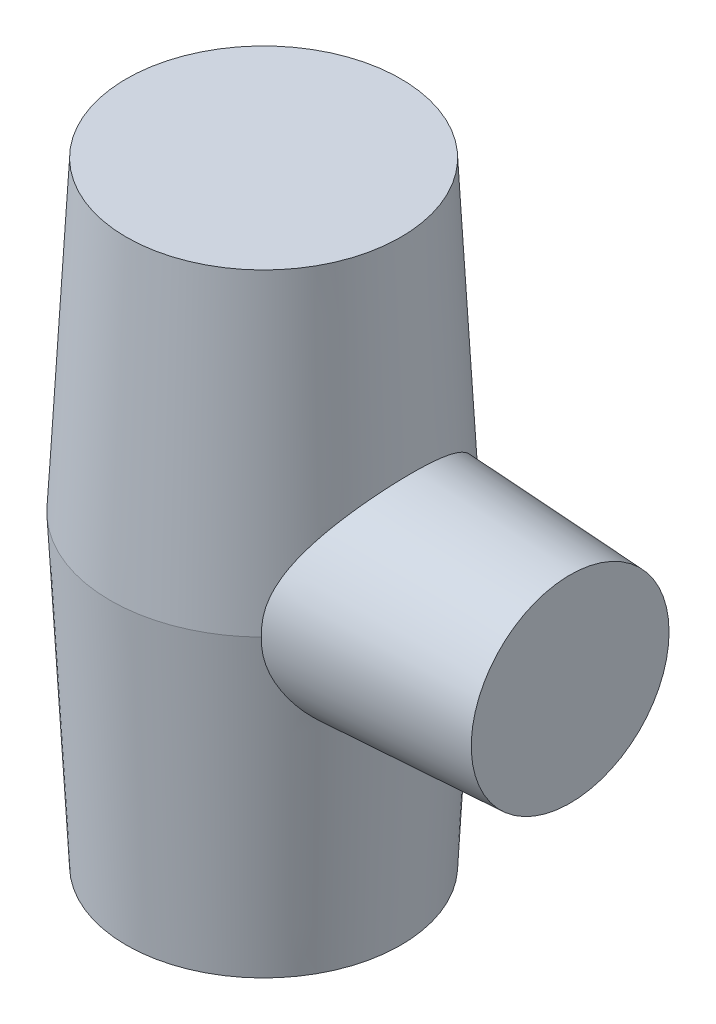
ISO-10303-21;
HEADER;
FILE_DESCRIPTION(('STEP AP214'),'2;1');
FILE_NAME('part.step','',(''),(''),'','','');
FILE_SCHEMA(('AUTOMOTIVE_DESIGN { 1 0 10303 214 1 1 1 1 }'));
ENDSEC;
DATA;
#1=APPLICATION_CONTEXT('core data for automotive mechanical design processes');
#2=APPLICATION_PROTOCOL_DEFINITION('international standard','automotive_design',2000,#1);
#3=PRODUCT_CONTEXT('',#1,'mechanical');
#4=PRODUCT('Part','Part','',(#3));
#5=PRODUCT_RELATED_PRODUCT_CATEGORY('part','',(#4));
#6=PRODUCT_DEFINITION_FORMATION('','',#4);
#7=PRODUCT_DEFINITION_CONTEXT('part definition',#1,'design');
#8=PRODUCT_DEFINITION('design','',#6,#7);
#9=PRODUCT_DEFINITION_SHAPE('','',#8);
#10=(LENGTH_UNIT() NAMED_UNIT(*) SI_UNIT(.MILLI.,.METRE.));
#11=(NAMED_UNIT(*) PLANE_ANGLE_UNIT() SI_UNIT($,.RADIAN.));
#12=(NAMED_UNIT(*) SI_UNIT($,.STERADIAN.) SOLID_ANGLE_UNIT());
#13=UNCERTAINTY_MEASURE_WITH_UNIT(LENGTH_MEASURE(1.E-05),#10,'distance_accuracy_value','');
#14=(GEOMETRIC_REPRESENTATION_CONTEXT(3) GLOBAL_UNCERTAINTY_ASSIGNED_CONTEXT((#13)) GLOBAL_UNIT_ASSIGNED_CONTEXT((#10,
#11,#12)) REPRESENTATION_CONTEXT('',''));
#15=CARTESIAN_POINT('',(0.,0.,0.));
#16=DIRECTION('',(0.,0.,1.));
#17=DIRECTION('',(1.,0.,0.));
#18=AXIS2_PLACEMENT_3D('',#15,#16,#17);
#19=CARTESIAN_POINT('',(0.,0.,0.));
#20=DIRECTION('',(0.,1.,0.));
#21=DIRECTION('',(0.,0.,1.));
#22=AXIS2_PLACEMENT_3D('',#19,#20,#21);
#23=CONICAL_SURFACE('',#22,1.27,0.0523598775598299);
#24=CARTESIAN_POINT('',(0.,-2.54,0.));
#25=DIRECTION('',(0.,1.,0.));
#26=DIRECTION('',(0.,0.,1.));
#27=AXIS2_PLACEMENT_3D('',#24,#25,#26);
#28=CIRCLE('',#27,1.13688424062108);
#29=CARTESIAN_POINT('',(0.,-2.54,1.13688424062108));
#30=VERTEX_POINT('',#29);
#31=EDGE_CURVE('E50',#30,#30,#28,.T.);
#32=ORIENTED_EDGE('',*,*,#31,.T.);
#33=EDGE_LOOP('',(#32));
#34=FACE_BOUND('',#33,.T.);
#35=CARTESIAN_POINT('',(0.,0.,0.));
#36=DIRECTION('',(0.,1.,0.));
#37=DIRECTION('',(0.,0.,1.));
#38=AXIS2_PLACEMENT_3D('',#35,#36,#37);
#39=CIRCLE('',#38,1.27);
#40=CARTESIAN_POINT('',(0.89013230422762,0.,-0.905850142667334));
#41=VERTEX_POINT('',#40);
#42=CARTESIAN_POINT('',(0.89013230422762,0.,0.905850142667334));
#43=VERTEX_POINT('',#42);
#44=EDGE_CURVE('E56',#41,#43,#39,.T.);
#45=ORIENTED_EDGE('',*,*,#44,.F.);
#46=CARTESIAN_POINT('',(0.902993829037968,0.09545,-0.900129472455373));
#47=CARTESIAN_POINT('',(0.899563521077237,0.0773853398247002,-0.902226936848446));
#48=CARTESIAN_POINT('',(0.896664747925735,0.0591576279351425,-0.903759584390583));
#49=CARTESIAN_POINT('',(0.892011780989021,0.0224961633339946,-0.905658388394876));
#50=CARTESIAN_POINT('',(0.890257671408119,0.00406239556585123,-0.906024459048413));
#51=CARTESIAN_POINT('',(0.886860011535402,-0.0509631322679103,-0.905322282522964));
#52=CARTESIAN_POINT('',(0.887003469530997,-0.0876762268203756,-0.902500461803508));
#53=CARTESIAN_POINT('',(0.891955287818575,-0.160118814379447,-0.892242842783682));
#54=CARTESIAN_POINT('',(0.896768043778309,-0.195847347926662,-0.884802699180811));
#55=CARTESIAN_POINT('',(0.910160266259075,-0.265478418949812,-0.865732974699965));
#56=CARTESIAN_POINT('',(0.918749072768013,-0.299376193144448,-0.85409301855054));
#57=CARTESIAN_POINT('',(0.942414725395455,-0.377668811539888,-0.821829855095488));
#58=CARTESIAN_POINT('',(0.958715129242293,-0.420972045395443,-0.799473834494679));
#59=CARTESIAN_POINT('',(0.993621907952189,-0.502750970367946,-0.748557004267139));
#60=CARTESIAN_POINT('',(1.01223295837934,-0.54121654542534,-0.719983522835871));
#61=CARTESIAN_POINT('',(1.0501692397141,-0.614081915694392,-0.656311237232074));
#62=CARTESIAN_POINT('',(1.0695000636707,-0.648341368280668,-0.621055041369575));
#63=CARTESIAN_POINT('',(1.10653005936935,-0.711023167960193,-0.544990645324445));
#64=CARTESIAN_POINT('',(1.12423131018231,-0.73945301119773,-0.504189688759287));
#65=CARTESIAN_POINT('',(1.15479707987866,-0.787191304702011,-0.421883488367413));
#66=CARTESIAN_POINT('',(1.16796873201699,-0.807128850531637,-0.380859935669848));
#67=CARTESIAN_POINT('',(1.19062589201974,-0.840907231765079,-0.295403338089634));
#68=CARTESIAN_POINT('',(1.20011310177312,-0.854750882408927,-0.250971878745396));
#69=CARTESIAN_POINT('',(1.21455332688064,-0.875676204002808,-0.159535283860463));
#70=CARTESIAN_POINT('',(1.21948049556855,-0.882719338724911,-0.112517058626506));
#71=CARTESIAN_POINT('',(1.2241774710219,-0.889435879175606,-0.0177053806453295));
#72=CARTESIAN_POINT('',(1.22394946098893,-0.889112404639077,0.0300877353693051));
#73=CARTESIAN_POINT('',(1.21864672221714,-0.881524364695857,0.120098472806691));
#74=CARTESIAN_POINT('',(1.21404739141158,-0.874940597763992,0.162404853768124));
#75=CARTESIAN_POINT('',(1.20108465235309,-0.856161109266416,0.245141552434992));
#76=CARTESIAN_POINT('',(1.19272069862073,-0.843964574426408,0.28557159732971));
#77=CARTESIAN_POINT('',(1.17252931717718,-0.813975861100101,0.365080522469261));
#78=CARTESIAN_POINT('',(1.16059009868997,-0.796001432842797,0.404061396814618));
#79=CARTESIAN_POINT('',(1.13425134794747,-0.755239072929599,0.478504654435579));
#80=CARTESIAN_POINT('',(1.11985065010083,-0.732448859627796,0.513965358161199));
#81=CARTESIAN_POINT('',(1.08719463381925,-0.678721788909307,0.586195786762102));
#82=CARTESIAN_POINT('',(1.06868765418509,-0.647070045218502,0.622319210795699));
#83=CARTESIAN_POINT('',(1.03124993436713,-0.578550370350181,0.689049959263568));
#84=CARTESIAN_POINT('',(1.01231876497211,-0.541676934603355,0.71965138412374));
#85=CARTESIAN_POINT('',(0.977845227808935,-0.467001968118888,0.772029192668481));
#86=CARTESIAN_POINT('',(0.962154154497761,-0.429678597352142,0.794387311468604));
#87=CARTESIAN_POINT('',(0.933857756057502,-0.351218844644737,0.833652671145697));
#88=CARTESIAN_POINT('',(0.921244808257789,-0.310092236974465,0.850573410787328));
#89=CARTESIAN_POINT('',(0.903565917458215,-0.234284730448333,0.874988175626711));
#90=CARTESIAN_POINT('',(0.897435677682342,-0.200267024377208,0.883751169602216));
#91=CARTESIAN_POINT('',(0.889290183961166,-0.130936906981449,0.897073092401517));
#92=CARTESIAN_POINT('',(0.887269421193179,-0.095626293588111,0.901637644801965));
#93=CARTESIAN_POINT('',(0.88772101446878,-0.0341388391533053,0.905710569463788));
#94=CARTESIAN_POINT('',(0.889147796742904,-0.00801232790410929,0.906235819460731));
#95=CARTESIAN_POINT('',(0.894342522084486,0.0440102565928487,0.904937719289486));
#96=CARTESIAN_POINT('',(0.898115785346357,0.069905670157954,0.903109021889273));
#97=CARTESIAN_POINT('',(0.902993829037968,0.09545,0.900129472455373));
#98=B_SPLINE_CURVE_WITH_KNOTS('',3,(#46,#47,#48,#49,#50,#51,#52,#53,#54,#55,#56,#57,#58,#59,#60,
#61,#62,#63,#64,#65,#66,#67,#68,#69,#70,#71,#72,#73,#74,#75,#76,#77,#78,#79,#80,#81,#82,#83,#84,
#85,#86,#87,#88,#89,#90,#91,#92,#93,#94,#95,#96,#97),.UNSPECIFIED.,.F.,.F.,(4,2,2,2,2,2,2,2,2,2,
2,2,2,2,2,2,2,2,2,2,2,2,2,2,2,4),(0.,0.0554932322940132,0.110990546348686,0.220781523726096,
0.330675958499507,0.440843757883449,0.59418084557976,0.747833426616677,0.905697627430591,
1.06335754386625,1.20519371243617,1.34696428699992,1.48953359308265,1.63204252265469,
1.7606371551114,1.88925042643865,2.02240161472891,2.15561603004799,2.30944088890734,
2.46342912997503,2.60171306613654,2.73965099957207,2.84619644566142,2.9525989713992,
3.03090410318366,3.10938742737697),.UNSPECIFIED.);
#99=EDGE_CURVE('E63',#41,#43,#98,.T.);
#100=ORIENTED_EDGE('',*,*,#99,.T.);
#101=EDGE_LOOP('',(#45,#100));
#102=FACE_BOUND('',#101,.T.);
#103=ADVANCED_FACE('F37',(#34,#102),#23,.T.);
#104=CARTESIAN_POINT('',(0.,0.,0.));
#105=DIRECTION('',(0.,-1.,0.));
#106=DIRECTION('',(0.,0.,1.));
#107=AXIS2_PLACEMENT_3D('',#104,#105,#106);
#108=CONICAL_SURFACE('',#107,1.27,0.0523598775598299);
#109=CARTESIAN_POINT('',(0.,2.54,0.));
#110=DIRECTION('',(0.,1.,0.));
#111=DIRECTION('',(0.,0.,1.));
#112=AXIS2_PLACEMENT_3D('',#109,#110,#111);
#113=CIRCLE('',#112,1.13688424062108);
#114=CARTESIAN_POINT('',(0.,2.54,1.13688424062108));
#115=VERTEX_POINT('',#114);
#116=EDGE_CURVE('E61',#115,#115,#113,.T.);
#117=ORIENTED_EDGE('',*,*,#116,.F.);
#118=EDGE_LOOP('',(#117));
#119=FACE_BOUND('',#118,.T.);
#120=CARTESIAN_POINT('',(0.902993829037968,-0.09545,-0.900129472455373));
#121=CARTESIAN_POINT('',(0.899563521077237,-0.0773853398247002,-0.902226936848446));
#122=CARTESIAN_POINT('',(0.896664747925735,-0.0591576279351425,-0.903759584390583));
#123=CARTESIAN_POINT('',(0.892011780989021,-0.0224961633339946,-0.905658388394876));
#124=CARTESIAN_POINT('',(0.890257671408119,-0.00406239556585123,-0.906024459048413));
#125=CARTESIAN_POINT('',(0.886860011535402,0.0509631322679103,-0.905322282522964));
#126=CARTESIAN_POINT('',(0.887003469530997,0.0876762268203756,-0.902500461803508));
#127=CARTESIAN_POINT('',(0.891955287818575,0.160118814379447,-0.892242842783682));
#128=CARTESIAN_POINT('',(0.896768043778309,0.195847347926662,-0.884802699180811));
#129=CARTESIAN_POINT('',(0.910160266259075,0.265478418949812,-0.865732974699965));
#130=CARTESIAN_POINT('',(0.918749072768013,0.299376193144448,-0.85409301855054));
#131=CARTESIAN_POINT('',(0.942414725395455,0.377668811539888,-0.821829855095488));
#132=CARTESIAN_POINT('',(0.958715129242293,0.420972045395443,-0.799473834494679));
#133=CARTESIAN_POINT('',(0.993621907952189,0.502750970367946,-0.748557004267139));
#134=CARTESIAN_POINT('',(1.01223295837934,0.54121654542534,-0.719983522835871));
#135=CARTESIAN_POINT('',(1.0501692397141,0.614081915694392,-0.656311237232074));
#136=CARTESIAN_POINT('',(1.0695000636707,0.648341368280668,-0.621055041369575));
#137=CARTESIAN_POINT('',(1.10653005936935,0.711023167960193,-0.544990645324445));
#138=CARTESIAN_POINT('',(1.12423131018231,0.73945301119773,-0.504189688759287));
#139=CARTESIAN_POINT('',(1.15479707987866,0.787191304702011,-0.421883488367413));
#140=CARTESIAN_POINT('',(1.16796873201699,0.807128850531637,-0.380859935669848));
#141=CARTESIAN_POINT('',(1.19062589201974,0.840907231765079,-0.295403338089634));
#142=CARTESIAN_POINT('',(1.20011310177312,0.854750882408927,-0.250971878745396));
#143=CARTESIAN_POINT('',(1.21455332688064,0.875676204002808,-0.159535283860463));
#144=CARTESIAN_POINT('',(1.21948049556855,0.882719338724911,-0.112517058626506));
#145=CARTESIAN_POINT('',(1.2241774710219,0.889435879175606,-0.0177053806453295));
#146=CARTESIAN_POINT('',(1.22394946098893,0.889112404639077,0.0300877353693051));
#147=CARTESIAN_POINT('',(1.21864672221714,0.881524364695857,0.120098472806691));
#148=CARTESIAN_POINT('',(1.21404739141158,0.874940597763992,0.162404853768124));
#149=CARTESIAN_POINT('',(1.20108465235309,0.856161109266416,0.245141552434992));
#150=CARTESIAN_POINT('',(1.19272069862073,0.843964574426408,0.28557159732971));
#151=CARTESIAN_POINT('',(1.17252931717718,0.813975861100101,0.365080522469261));
#152=CARTESIAN_POINT('',(1.16059009868997,0.796001432842797,0.404061396814618));
#153=CARTESIAN_POINT('',(1.13425134794747,0.755239072929599,0.478504654435579));
#154=CARTESIAN_POINT('',(1.11985065010083,0.732448859627796,0.513965358161199));
#155=CARTESIAN_POINT('',(1.08719463381925,0.678721788909307,0.586195786762102));
#156=CARTESIAN_POINT('',(1.06868765418509,0.647070045218502,0.622319210795699));
#157=CARTESIAN_POINT('',(1.03124993436713,0.578550370350181,0.689049959263568));
#158=CARTESIAN_POINT('',(1.01231876497211,0.541676934603355,0.71965138412374));
#159=CARTESIAN_POINT('',(0.977845227808935,0.467001968118888,0.772029192668481));
#160=CARTESIAN_POINT('',(0.962154154497761,0.429678597352142,0.794387311468604));
#161=CARTESIAN_POINT('',(0.933857756057502,0.351218844644737,0.833652671145697));
#162=CARTESIAN_POINT('',(0.921244808257789,0.310092236974465,0.850573410787328));
#163=CARTESIAN_POINT('',(0.903565917458215,0.234284730448333,0.874988175626711));
#164=CARTESIAN_POINT('',(0.897435677682342,0.200267024377208,0.883751169602216));
#165=CARTESIAN_POINT('',(0.889290183961166,0.130936906981449,0.897073092401517));
#166=CARTESIAN_POINT('',(0.887269421193179,0.095626293588111,0.901637644801965));
#167=CARTESIAN_POINT('',(0.88772101446878,0.0341388391533053,0.905710569463788));
#168=CARTESIAN_POINT('',(0.889147796742904,0.00801232790410929,0.906235819460731));
#169=CARTESIAN_POINT('',(0.894342522084486,-0.0440102565928487,0.904937719289486));
#170=CARTESIAN_POINT('',(0.898115785346357,-0.069905670157954,0.903109021889273));
#171=CARTESIAN_POINT('',(0.902993829037968,-0.09545,0.900129472455373));
#172=B_SPLINE_CURVE_WITH_KNOTS('',3,(#120,#121,#122,#123,#124,#125,#126,#127,#128,#129,#130,
#131,#132,#133,#134,#135,#136,#137,#138,#139,#140,#141,#142,#143,#144,#145,#146,#147,#148,#149,
#150,#151,#152,#153,#154,#155,#156,#157,#158,#159,#160,#161,#162,#163,#164,#165,#166,#167,#168,
#169,#170,#171),.UNSPECIFIED.,.F.,.F.,(4,2,2,2,2,2,2,2,2,2,2,2,2,2,2,2,2,2,2,2,2,2,2,2,2,4),(0.,
0.0554932322940132,0.110990546348686,0.220781523726096,0.330675958499507,0.440843757883449,
0.59418084557976,0.747833426616677,0.905697627430591,1.06335754386625,1.20519371243617,
1.34696428699992,1.48953359308265,1.63204252265469,1.7606371551114,1.88925042643865,
2.02240161472891,2.15561603004799,2.30944088890734,2.46342912997503,2.60171306613654,
2.73965099957207,2.84619644566142,2.9525989713992,3.03090410318366,3.10938742737697),.UNSPECIFIED.);
#173=EDGE_CURVE('E11',#41,#43,#172,.T.);
#174=ORIENTED_EDGE('',*,*,#173,.F.);
#175=ORIENTED_EDGE('',*,*,#44,.T.);
#176=EDGE_LOOP('',(#174,#175));
#177=FACE_BOUND('',#176,.T.);
#178=ADVANCED_FACE('F58',(#119,#177),#108,.T.);
#179=CARTESIAN_POINT('',(0.,-2.54,0.));
#180=DIRECTION('',(0.,1.,0.));
#181=DIRECTION('',(0.,0.,1.));
#182=AXIS2_PLACEMENT_3D('',#179,#180,#181);
#183=PLANE('',#182);
#184=ORIENTED_EDGE('',*,*,#31,.F.);
#185=EDGE_LOOP('',(#184));
#186=FACE_BOUND('',#185,.T.);
#187=ADVANCED_FACE('F85',(#186),#183,.F.);
#188=CARTESIAN_POINT('',(0.,2.54,0.));
#189=DIRECTION('',(0.,1.,0.));
#190=DIRECTION('',(0.,0.,1.));
#191=AXIS2_PLACEMENT_3D('',#188,#189,#190);
#192=PLANE('',#191);
#193=ORIENTED_EDGE('',*,*,#116,.T.);
#194=EDGE_LOOP('',(#193));
#195=FACE_BOUND('',#194,.T.);
#196=ADVANCED_FACE('F71',(#195),#192,.T.);
#197=CARTESIAN_POINT('',(0.,0.,0.));
#198=DIRECTION('',(-1.,0.,0.));
#199=DIRECTION('',(0.,0.,-1.));
#200=AXIS2_PLACEMENT_3D('',#197,#198,#199);
#201=CONICAL_SURFACE('',#200,0.9525,0.0523598775598299);
#202=ORIENTED_EDGE('',*,*,#99,.F.);
#203=ORIENTED_EDGE('',*,*,#173,.T.);
#204=EDGE_LOOP('',(#202,#203));
#205=FACE_BOUND('',#204,.T.);
#206=CARTESIAN_POINT('',(2.54,0.,0.));
#207=DIRECTION('',(1.,0.,0.));
#208=DIRECTION('',(0.,0.,-1.));
#209=AXIS2_PLACEMENT_3D('',#206,#207,#208);
#210=CIRCLE('',#209,0.819384240621075);
#211=CARTESIAN_POINT('',(2.54,0.,-0.819384240621075));
#212=VERTEX_POINT('',#211);
#213=EDGE_CURVE('E65',#212,#212,#210,.T.);
#214=ORIENTED_EDGE('',*,*,#213,.F.);
#215=EDGE_LOOP('',(#214));
#216=FACE_BOUND('',#215,.T.);
#217=ADVANCED_FACE('F67',(#205,#216),#201,.T.);
#218=CARTESIAN_POINT('',(2.54,0.,0.));
#219=DIRECTION('',(1.,0.,0.));
#220=DIRECTION('',(0.,0.,-1.));
#221=AXIS2_PLACEMENT_3D('',#218,#219,#220);
#222=PLANE('',#221);
#223=ORIENTED_EDGE('',*,*,#213,.T.);
#224=EDGE_LOOP('',(#223));
#225=FACE_BOUND('',#224,.T.);
#226=ADVANCED_FACE('F70',(#225),#222,.T.);
#227=CLOSED_SHELL('',(#103,#178,#187,#196,#217,#226));
#228=MANIFOLD_SOLID_BREP('B2',#227);
#229=ADVANCED_BREP_SHAPE_REPRESENTATION('',(#18,#228),#14);
#230=SHAPE_DEFINITION_REPRESENTATION(#9,#229);
ENDSEC;
END-ISO-10303-21;
